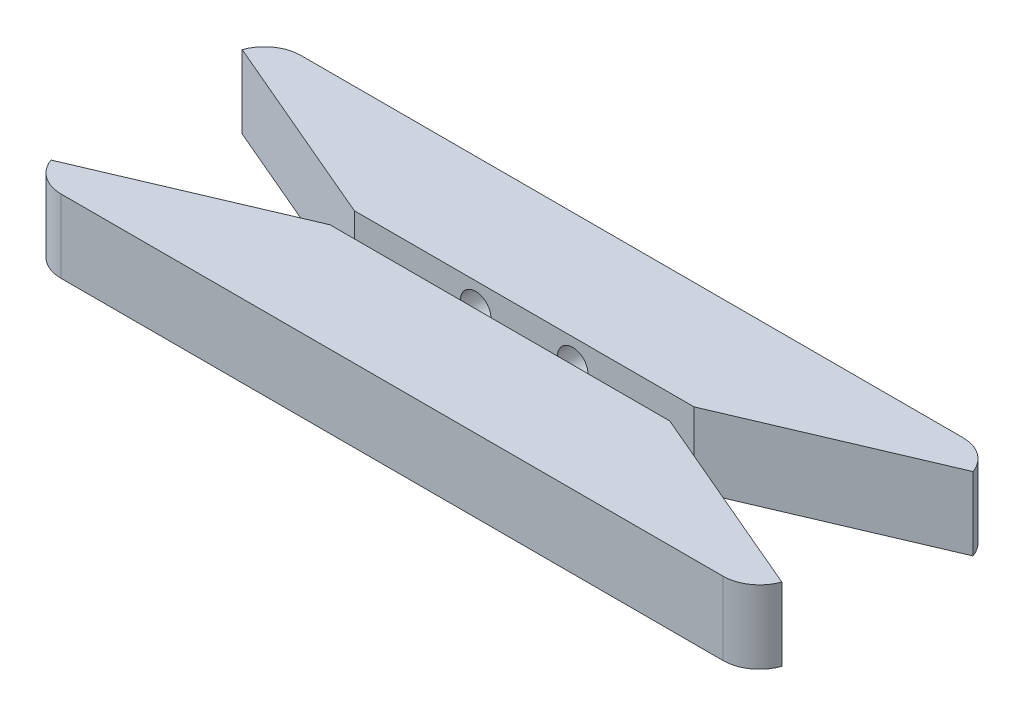
ISO-10303-21;
HEADER;
FILE_DESCRIPTION(('STEP AP214'),'2;1');
FILE_NAME('part.step','',(''),(''),'','','');
FILE_SCHEMA(('AUTOMOTIVE_DESIGN { 1 0 10303 214 1 1 1 1 }'));
ENDSEC;
DATA;
#1=APPLICATION_CONTEXT('core data for automotive mechanical design processes');
#2=APPLICATION_PROTOCOL_DEFINITION('international standard','automotive_design',2000,#1);
#3=PRODUCT_CONTEXT('',#1,'mechanical');
#4=PRODUCT('Part','Part','',(#3));
#5=PRODUCT_RELATED_PRODUCT_CATEGORY('part','',(#4));
#6=PRODUCT_DEFINITION_FORMATION('','',#4);
#7=PRODUCT_DEFINITION_CONTEXT('part definition',#1,'design');
#8=PRODUCT_DEFINITION('design','',#6,#7);
#9=PRODUCT_DEFINITION_SHAPE('','',#8);
#10=(LENGTH_UNIT() NAMED_UNIT(*) SI_UNIT(.MILLI.,.METRE.));
#11=(NAMED_UNIT(*) PLANE_ANGLE_UNIT() SI_UNIT($,.RADIAN.));
#12=(NAMED_UNIT(*) SI_UNIT($,.STERADIAN.) SOLID_ANGLE_UNIT());
#13=UNCERTAINTY_MEASURE_WITH_UNIT(LENGTH_MEASURE(1.E-05),#10,'distance_accuracy_value','');
#14=(GEOMETRIC_REPRESENTATION_CONTEXT(3) GLOBAL_UNCERTAINTY_ASSIGNED_CONTEXT((#13)) GLOBAL_UNIT_ASSIGNED_CONTEXT((#10,
#11,#12)) REPRESENTATION_CONTEXT('',''));
#15=CARTESIAN_POINT('',(0.,0.,0.));
#16=DIRECTION('',(0.,0.,1.));
#17=DIRECTION('',(1.,0.,0.));
#18=AXIS2_PLACEMENT_3D('',#15,#16,#17);
#19=CARTESIAN_POINT('',(-60.,12.,17.7));
#20=DIRECTION('',(0.392483925789515,0.,0.919758864049078));
#21=DIRECTION('',(-0.919758864049078,0.,0.392483925789515));
#22=AXIS2_PLACEMENT_3D('',#19,#20,#21);
#23=PLANE('',#22);
#24=DIRECTION('',(0.919758864049078,0.,-0.392483925789515));
#25=VECTOR('',#24,1.);
#26=CARTESIAN_POINT('',(-60.,0.,17.7));
#27=LINE('',#26,#25);
#28=CARTESIAN_POINT('',(-60.,0.,17.7));
#29=VERTEX_POINT('',#28);
#30=CARTESIAN_POINT('',(-27.895,0.,4.));
#31=VERTEX_POINT('',#30);
#32=EDGE_CURVE('E112',#29,#31,#27,.T.);
#33=ORIENTED_EDGE('',*,*,#32,.F.);
#34=DIRECTION('',(0.,-1.,0.));
#35=VECTOR('',#34,1.);
#36=CARTESIAN_POINT('',(-60.,12.,17.7));
#37=LINE('',#36,#35);
#38=CARTESIAN_POINT('',(-60.,12.,17.7));
#39=VERTEX_POINT('',#38);
#40=EDGE_CURVE('E95',#39,#29,#37,.T.);
#41=ORIENTED_EDGE('',*,*,#40,.F.);
#42=DIRECTION('',(0.919758864049078,0.,-0.392483925789515));
#43=VECTOR('',#42,1.);
#44=CARTESIAN_POINT('',(-60.,12.,17.7));
#45=LINE('',#44,#43);
#46=CARTESIAN_POINT('',(-27.895,12.,4.));
#47=VERTEX_POINT('',#46);
#48=EDGE_CURVE('E102',#39,#47,#45,.T.);
#49=ORIENTED_EDGE('',*,*,#48,.T.);
#50=DIRECTION('',(0.,-1.,0.));
#51=VECTOR('',#50,1.);
#52=CARTESIAN_POINT('',(-27.895,12.,4.));
#53=LINE('',#52,#51);
#54=EDGE_CURVE('E113',#47,#31,#53,.T.);
#55=ORIENTED_EDGE('',*,*,#54,.T.);
#56=EDGE_LOOP('',(#33,#41,#49,#55));
#57=FACE_BOUND('',#56,.T.);
#58=ADVANCED_FACE('F43',(#57),#23,.F.);
#59=CARTESIAN_POINT('',(-27.895,12.,4.));
#60=DIRECTION('',(0.,0.,1.));
#61=DIRECTION('',(-1.,0.,0.));
#62=AXIS2_PLACEMENT_3D('',#59,#60,#61);
#63=PLANE('',#62);
#64=CARTESIAN_POINT('',(-7.97,8.,4.));
#65=DIRECTION('',(0.,0.,1.));
#66=DIRECTION('',(1.,0.,0.));
#67=AXIS2_PLACEMENT_3D('',#64,#65,#66);
#68=CIRCLE('',#67,2.5);
#69=CARTESIAN_POINT('',(-5.47,8.,4.));
#70=VERTEX_POINT('',#69);
#71=EDGE_CURVE('E155',#70,#70,#68,.T.);
#72=ORIENTED_EDGE('',*,*,#71,.T.);
#73=EDGE_LOOP('',(#72));
#74=FACE_BOUND('',#73,.T.);
#75=CARTESIAN_POINT('',(7.97,8.,4.));
#76=DIRECTION('',(0.,0.,1.));
#77=DIRECTION('',(-1.,0.,0.));
#78=AXIS2_PLACEMENT_3D('',#75,#76,#77);
#79=CIRCLE('',#78,2.5);
#80=CARTESIAN_POINT('',(5.47,8.,4.));
#81=VERTEX_POINT('',#80);
#82=EDGE_CURVE('E164',#81,#81,#79,.T.);
#83=ORIENTED_EDGE('',*,*,#82,.T.);
#84=EDGE_LOOP('',(#83));
#85=FACE_BOUND('',#84,.T.);
#86=DIRECTION('',(1.,0.,0.));
#87=VECTOR('',#86,1.);
#88=CARTESIAN_POINT('',(-27.895,0.,4.));
#89=LINE('',#88,#87);
#90=CARTESIAN_POINT('',(27.895,0.,4.));
#91=VERTEX_POINT('',#90);
#92=EDGE_CURVE('E142',#31,#91,#89,.T.);
#93=ORIENTED_EDGE('',*,*,#92,.F.);
#94=ORIENTED_EDGE('',*,*,#54,.F.);
#95=DIRECTION('',(1.,0.,0.));
#96=VECTOR('',#95,1.);
#97=CARTESIAN_POINT('',(-27.895,12.,4.));
#98=LINE('',#97,#96);
#99=CARTESIAN_POINT('',(27.895,12.,4.));
#100=VERTEX_POINT('',#99);
#101=EDGE_CURVE('E105',#47,#100,#98,.T.);
#102=ORIENTED_EDGE('',*,*,#101,.T.);
#103=DIRECTION('',(0.,-1.,0.));
#104=VECTOR('',#103,1.);
#105=CARTESIAN_POINT('',(27.895,12.,4.));
#106=LINE('',#105,#104);
#107=EDGE_CURVE('E117',#100,#91,#106,.T.);
#108=ORIENTED_EDGE('',*,*,#107,.T.);
#109=EDGE_LOOP('',(#93,#94,#102,#108));
#110=FACE_BOUND('',#109,.T.);
#111=ADVANCED_FACE('F148',(#74,#85,#110),#63,.F.);
#112=CARTESIAN_POINT('',(27.895,12.,4.));
#113=DIRECTION('',(-0.392483925789515,0.,0.919758864049078));
#114=DIRECTION('',(-0.919758864049078,0.,-0.392483925789515));
#115=AXIS2_PLACEMENT_3D('',#112,#113,#114);
#116=PLANE('',#115);
#117=DIRECTION('',(0.919758864049078,0.,0.392483925789515));
#118=VECTOR('',#117,1.);
#119=CARTESIAN_POINT('',(27.895,0.,4.));
#120=LINE('',#119,#118);
#121=CARTESIAN_POINT('',(60.,0.,17.7));
#122=VERTEX_POINT('',#121);
#123=EDGE_CURVE('E135',#91,#122,#120,.T.);
#124=ORIENTED_EDGE('',*,*,#123,.F.);
#125=ORIENTED_EDGE('',*,*,#107,.F.);
#126=DIRECTION('',(0.919758864049078,0.,0.392483925789515));
#127=VECTOR('',#126,1.);
#128=CARTESIAN_POINT('',(27.895,12.,4.));
#129=LINE('',#128,#127);
#130=CARTESIAN_POINT('',(60.,12.,17.7));
#131=VERTEX_POINT('',#130);
#132=EDGE_CURVE('E137',#100,#131,#129,.T.);
#133=ORIENTED_EDGE('',*,*,#132,.T.);
#134=DIRECTION('',(0.,-1.,0.));
#135=VECTOR('',#134,1.);
#136=CARTESIAN_POINT('',(60.,12.,17.7));
#137=LINE('',#136,#135);
#138=EDGE_CURVE('E126',#131,#122,#137,.T.);
#139=ORIENTED_EDGE('',*,*,#138,.T.);
#140=EDGE_LOOP('',(#124,#125,#133,#139));
#141=FACE_BOUND('',#140,.T.);
#142=ADVANCED_FACE('F133',(#141),#116,.F.);
#143=CARTESIAN_POINT('',(-60.,12.,21.7));
#144=DIRECTION('',(0.,0.,-1.));
#145=DIRECTION('',(1.,0.,0.));
#146=AXIS2_PLACEMENT_3D('',#143,#144,#145);
#147=PLANE('',#146);
#148=DIRECTION('',(-1.,0.,0.));
#149=VECTOR('',#148,1.);
#150=CARTESIAN_POINT('',(-60.,12.,21.7));
#151=LINE('',#150,#149);
#152=CARTESIAN_POINT('',(54.3431457505076,12.,21.7));
#153=VERTEX_POINT('',#152);
#154=CARTESIAN_POINT('',(-54.3431457505076,12.,21.7));
#155=VERTEX_POINT('',#154);
#156=EDGE_CURVE('E138',#153,#155,#151,.T.);
#157=ORIENTED_EDGE('',*,*,#156,.T.);
#158=DIRECTION('',(0.,1.,0.));
#159=VECTOR('',#158,1.);
#160=CARTESIAN_POINT('',(-54.3431457505076,12.,21.7));
#161=LINE('',#160,#159);
#162=CARTESIAN_POINT('',(-54.3431457505076,0.,21.7));
#163=VERTEX_POINT('',#162);
#164=EDGE_CURVE('E98',#163,#155,#161,.T.);
#165=ORIENTED_EDGE('',*,*,#164,.F.);
#166=DIRECTION('',(-1.,0.,0.));
#167=VECTOR('',#166,1.);
#168=CARTESIAN_POINT('',(-60.,0.,21.7));
#169=LINE('',#168,#167);
#170=CARTESIAN_POINT('',(54.3431457505076,0.,21.7));
#171=VERTEX_POINT('',#170);
#172=EDGE_CURVE('E109',#171,#163,#169,.T.);
#173=ORIENTED_EDGE('',*,*,#172,.F.);
#174=DIRECTION('',(0.,-1.,0.));
#175=VECTOR('',#174,1.);
#176=CARTESIAN_POINT('',(54.3431457505076,12.,21.7));
#177=LINE('',#176,#175);
#178=EDGE_CURVE('E115',#153,#171,#177,.T.);
#179=ORIENTED_EDGE('',*,*,#178,.F.);
#180=EDGE_LOOP('',(#157,#165,#173,#179));
#181=FACE_BOUND('',#180,.T.);
#182=ADVANCED_FACE('F230',(#181),#147,.F.);
#183=CARTESIAN_POINT('',(0.,12.,4.));
#184=DIRECTION('',(0.,1.,0.));
#185=DIRECTION('',(0.,0.,-1.));
#186=AXIS2_PLACEMENT_3D('',#183,#184,#185);
#187=PLANE('',#186);
#188=ORIENTED_EDGE('',*,*,#132,.F.);
#189=ORIENTED_EDGE('',*,*,#101,.F.);
#190=ORIENTED_EDGE('',*,*,#48,.F.);
#191=CARTESIAN_POINT('',(-54.3431457505076,12.,15.7));
#192=DIRECTION('',(0.,-1.,0.));
#193=DIRECTION('',(0.,0.,-1.));
#194=AXIS2_PLACEMENT_3D('',#191,#192,#193);
#195=CIRCLE('',#194,6.);
#196=EDGE_CURVE('E51',#155,#39,#195,.T.);
#197=ORIENTED_EDGE('',*,*,#196,.F.);
#198=ORIENTED_EDGE('',*,*,#156,.F.);
#199=CARTESIAN_POINT('',(54.3431457505076,12.,15.7));
#200=DIRECTION('',(0.,-1.,0.));
#201=DIRECTION('',(0.,0.,-1.));
#202=AXIS2_PLACEMENT_3D('',#199,#200,#201);
#203=CIRCLE('',#202,6.);
#204=EDGE_CURVE('E12',#131,#153,#203,.T.);
#205=ORIENTED_EDGE('',*,*,#204,.F.);
#206=EDGE_LOOP('',(#188,#189,#190,#197,#198,#205));
#207=FACE_BOUND('',#206,.T.);
#208=ADVANCED_FACE('F103',(#207),#187,.T.);
#209=CARTESIAN_POINT('',(0.,0.,4.));
#210=DIRECTION('',(0.,1.,0.));
#211=DIRECTION('',(0.,0.,-1.));
#212=AXIS2_PLACEMENT_3D('',#209,#210,#211);
#213=PLANE('',#212);
#214=ORIENTED_EDGE('',*,*,#172,.T.);
#215=CARTESIAN_POINT('',(-54.3431457505076,0.,15.7));
#216=DIRECTION('',(0.,-1.,0.));
#217=DIRECTION('',(0.,0.,-1.));
#218=AXIS2_PLACEMENT_3D('',#215,#216,#217);
#219=CIRCLE('',#218,6.);
#220=EDGE_CURVE('E122',#29,#163,#219,.F.);
#221=ORIENTED_EDGE('',*,*,#220,.F.);
#222=ORIENTED_EDGE('',*,*,#32,.T.);
#223=ORIENTED_EDGE('',*,*,#92,.T.);
#224=ORIENTED_EDGE('',*,*,#123,.T.);
#225=CARTESIAN_POINT('',(54.3431457505076,0.,15.7));
#226=DIRECTION('',(0.,-1.,0.));
#227=DIRECTION('',(0.,0.,-1.));
#228=AXIS2_PLACEMENT_3D('',#225,#226,#227);
#229=CIRCLE('',#228,6.);
#230=EDGE_CURVE('E100',#171,#122,#229,.F.);
#231=ORIENTED_EDGE('',*,*,#230,.F.);
#232=EDGE_LOOP('',(#214,#221,#222,#223,#224,#231));
#233=FACE_BOUND('',#232,.T.);
#234=ADVANCED_FACE('F141',(#233),#213,.F.);
#235=CARTESIAN_POINT('',(7.97,8.,12.5));
#236=DIRECTION('',(0.,0.,-1.));
#237=DIRECTION('',(1.,0.,0.));
#238=AXIS2_PLACEMENT_3D('',#235,#236,#237);
#239=CYLINDRICAL_SURFACE('',#238,2.5);
#240=CARTESIAN_POINT('',(7.97,8.,12.5));
#241=DIRECTION('',(0.,0.,1.));
#242=DIRECTION('',(-1.,0.,0.));
#243=AXIS2_PLACEMENT_3D('',#240,#241,#242);
#244=CIRCLE('',#243,2.5);
#245=CARTESIAN_POINT('',(5.47,8.,12.5));
#246=VERTEX_POINT('',#245);
#247=EDGE_CURVE('E160',#246,#246,#244,.T.);
#248=ORIENTED_EDGE('',*,*,#247,.T.);
#249=EDGE_LOOP('',(#248));
#250=FACE_BOUND('',#249,.T.);
#251=ORIENTED_EDGE('',*,*,#82,.F.);
#252=EDGE_LOOP('',(#251));
#253=FACE_BOUND('',#252,.T.);
#254=ADVANCED_FACE('F169',(#250,#253),#239,.F.);
#255=CARTESIAN_POINT('',(7.97,8.,12.5));
#256=DIRECTION('',(0.,0.,1.));
#257=DIRECTION('',(-1.,0.,0.));
#258=AXIS2_PLACEMENT_3D('',#255,#256,#257);
#259=PLANE('',#258);
#260=ORIENTED_EDGE('',*,*,#247,.F.);
#261=EDGE_LOOP('',(#260));
#262=FACE_BOUND('',#261,.T.);
#263=ADVANCED_FACE('F171',(#262),#259,.F.);
#264=CARTESIAN_POINT('',(-7.97,8.,12.5));
#265=DIRECTION('',(0.,0.,-1.));
#266=DIRECTION('',(1.,0.,0.));
#267=AXIS2_PLACEMENT_3D('',#264,#265,#266);
#268=CYLINDRICAL_SURFACE('',#267,2.5);
#269=CARTESIAN_POINT('',(-7.97,8.,12.5));
#270=DIRECTION('',(0.,0.,1.));
#271=DIRECTION('',(1.,0.,0.));
#272=AXIS2_PLACEMENT_3D('',#269,#270,#271);
#273=CIRCLE('',#272,2.5);
#274=CARTESIAN_POINT('',(-5.47,8.,12.5));
#275=VERTEX_POINT('',#274);
#276=EDGE_CURVE('E153',#275,#275,#273,.T.);
#277=ORIENTED_EDGE('',*,*,#276,.T.);
#278=EDGE_LOOP('',(#277));
#279=FACE_BOUND('',#278,.T.);
#280=ORIENTED_EDGE('',*,*,#71,.F.);
#281=EDGE_LOOP('',(#280));
#282=FACE_BOUND('',#281,.T.);
#283=ADVANCED_FACE('F178',(#279,#282),#268,.F.);
#284=CARTESIAN_POINT('',(-7.97,8.,12.5));
#285=DIRECTION('',(0.,0.,-1.));
#286=DIRECTION('',(1.,0.,0.));
#287=AXIS2_PLACEMENT_3D('',#284,#285,#286);
#288=PLANE('',#287);
#289=ORIENTED_EDGE('',*,*,#276,.F.);
#290=EDGE_LOOP('',(#289));
#291=FACE_BOUND('',#290,.T.);
#292=ADVANCED_FACE('F192',(#291),#288,.T.);
#293=CARTESIAN_POINT('',(54.3431457505076,12.,15.7));
#294=DIRECTION('',(0.,-1.,0.));
#295=DIRECTION('',(0.,0.,1.));
#296=AXIS2_PLACEMENT_3D('',#293,#294,#295);
#297=CYLINDRICAL_SURFACE('',#296,6.);
#298=ORIENTED_EDGE('',*,*,#204,.T.);
#299=ORIENTED_EDGE('',*,*,#178,.T.);
#300=ORIENTED_EDGE('',*,*,#230,.T.);
#301=ORIENTED_EDGE('',*,*,#138,.F.);
#302=EDGE_LOOP('',(#298,#299,#300,#301));
#303=FACE_BOUND('',#302,.T.);
#304=ADVANCED_FACE('F125',(#303),#297,.T.);
#305=CARTESIAN_POINT('',(-54.3431457505076,12.,15.7));
#306=DIRECTION('',(0.,1.,0.));
#307=DIRECTION('',(0.,0.,-1.));
#308=AXIS2_PLACEMENT_3D('',#305,#306,#307);
#309=CYLINDRICAL_SURFACE('',#308,6.);
#310=ORIENTED_EDGE('',*,*,#196,.T.);
#311=ORIENTED_EDGE('',*,*,#40,.T.);
#312=ORIENTED_EDGE('',*,*,#220,.T.);
#313=ORIENTED_EDGE('',*,*,#164,.T.);
#314=EDGE_LOOP('',(#310,#311,#312,#313));
#315=FACE_BOUND('',#314,.T.);
#316=ADVANCED_FACE('F45',(#315),#309,.T.);
#317=CLOSED_SHELL('',(#58,#111,#142,#182,#208,#234,#254,#263,#283,#292,#304,#316));
#318=MANIFOLD_SOLID_BREP('B2',#317);
#319=CARTESIAN_POINT('',(-60.,12.,-13.7));
#320=DIRECTION('',(0.392483925789515,0.,-0.919758864049078));
#321=DIRECTION('',(-0.919758864049078,0.,-0.392483925789515));
#322=AXIS2_PLACEMENT_3D('',#319,#320,#321);
#323=PLANE('',#322);
#324=DIRECTION('',(0.919758864049078,0.,0.392483925789515));
#325=VECTOR('',#324,1.);
#326=CARTESIAN_POINT('',(-60.,0.,-13.7));
#327=LINE('',#326,#325);
#328=CARTESIAN_POINT('',(-60.,0.,-13.7));
#329=VERTEX_POINT('',#328);
#330=CARTESIAN_POINT('',(-27.895,0.,0.));
#331=VERTEX_POINT('',#330);
#332=EDGE_CURVE('E384',#329,#331,#327,.T.);
#333=ORIENTED_EDGE('',*,*,#332,.T.);
#334=DIRECTION('',(0.,-1.,0.));
#335=VECTOR('',#334,1.);
#336=CARTESIAN_POINT('',(-27.895,12.,0.));
#337=LINE('',#336,#335);
#338=CARTESIAN_POINT('',(-27.895,12.,0.));
#339=VERTEX_POINT('',#338);
#340=EDGE_CURVE('E341',#339,#331,#337,.T.);
#341=ORIENTED_EDGE('',*,*,#340,.F.);
#342=DIRECTION('',(0.919758864049078,0.,0.392483925789515));
#343=VECTOR('',#342,1.);
#344=CARTESIAN_POINT('',(-60.,12.,-13.7));
#345=LINE('',#344,#343);
#346=CARTESIAN_POINT('',(-60.,12.,-13.7));
#347=VERTEX_POINT('',#346);
#348=EDGE_CURVE('E331',#347,#339,#345,.T.);
#349=ORIENTED_EDGE('',*,*,#348,.F.);
#350=DIRECTION('',(0.,-1.,0.));
#351=VECTOR('',#350,1.);
#352=CARTESIAN_POINT('',(-60.,12.,-13.7));
#353=LINE('',#352,#351);
#354=EDGE_CURVE('E339',#347,#329,#353,.T.);
#355=ORIENTED_EDGE('',*,*,#354,.T.);
#356=EDGE_LOOP('',(#333,#341,#349,#355));
#357=FACE_BOUND('',#356,.T.);
#358=ADVANCED_FACE('F279',(#357),#323,.F.);
#359=CARTESIAN_POINT('',(-27.895,12.,0.));
#360=DIRECTION('',(0.,0.,-1.));
#361=DIRECTION('',(-1.,0.,0.));
#362=AXIS2_PLACEMENT_3D('',#359,#360,#361);
#363=PLANE('',#362);
#364=CARTESIAN_POINT('',(-7.97,8.,0.));
#365=DIRECTION('',(0.,0.,1.));
#366=DIRECTION('',(1.,0.,0.));
#367=AXIS2_PLACEMENT_3D('',#364,#365,#366);
#368=CIRCLE('',#367,2.5);
#369=CARTESIAN_POINT('',(-5.47,8.,0.));
#370=VERTEX_POINT('',#369);
#371=EDGE_CURVE('E395',#370,#370,#368,.T.);
#372=ORIENTED_EDGE('',*,*,#371,.F.);
#373=EDGE_LOOP('',(#372));
#374=FACE_BOUND('',#373,.T.);
#375=CARTESIAN_POINT('',(7.97,8.,0.));
#376=DIRECTION('',(0.,0.,1.));
#377=DIRECTION('',(-1.,0.,0.));
#378=AXIS2_PLACEMENT_3D('',#375,#376,#377);
#379=CIRCLE('',#378,2.5);
#380=CARTESIAN_POINT('',(5.47,8.,0.));
#381=VERTEX_POINT('',#380);
#382=EDGE_CURVE('E389',#381,#381,#379,.T.);
#383=ORIENTED_EDGE('',*,*,#382,.F.);
#384=EDGE_LOOP('',(#383));
#385=FACE_BOUND('',#384,.T.);
#386=DIRECTION('',(1.,0.,0.));
#387=VECTOR('',#386,1.);
#388=CARTESIAN_POINT('',(-27.895,0.,0.));
#389=LINE('',#388,#387);
#390=CARTESIAN_POINT('',(27.895,0.,0.));
#391=VERTEX_POINT('',#390);
#392=EDGE_CURVE('E375',#331,#391,#389,.T.);
#393=ORIENTED_EDGE('',*,*,#392,.T.);
#394=DIRECTION('',(0.,-1.,0.));
#395=VECTOR('',#394,1.);
#396=CARTESIAN_POINT('',(27.895,12.,0.));
#397=LINE('',#396,#395);
#398=CARTESIAN_POINT('',(27.895,12.,0.));
#399=VERTEX_POINT('',#398);
#400=EDGE_CURVE('E351',#399,#391,#397,.T.);
#401=ORIENTED_EDGE('',*,*,#400,.F.);
#402=DIRECTION('',(1.,0.,0.));
#403=VECTOR('',#402,1.);
#404=CARTESIAN_POINT('',(-27.895,12.,0.));
#405=LINE('',#404,#403);
#406=EDGE_CURVE('E343',#339,#399,#405,.T.);
#407=ORIENTED_EDGE('',*,*,#406,.F.);
#408=ORIENTED_EDGE('',*,*,#340,.T.);
#409=EDGE_LOOP('',(#393,#401,#407,#408));
#410=FACE_BOUND('',#409,.T.);
#411=ADVANCED_FACE('F410',(#374,#385,#410),#363,.F.);
#412=CARTESIAN_POINT('',(27.895,12.,0.));
#413=DIRECTION('',(-0.392483925789515,0.,-0.919758864049078));
#414=DIRECTION('',(-0.919758864049078,0.,0.392483925789515));
#415=AXIS2_PLACEMENT_3D('',#412,#413,#414);
#416=PLANE('',#415);
#417=DIRECTION('',(0.919758864049078,0.,-0.392483925789515));
#418=VECTOR('',#417,1.);
#419=CARTESIAN_POINT('',(27.895,0.,0.));
#420=LINE('',#419,#418);
#421=CARTESIAN_POINT('',(60.,0.,-13.7));
#422=VERTEX_POINT('',#421);
#423=EDGE_CURVE('E364',#391,#422,#420,.T.);
#424=ORIENTED_EDGE('',*,*,#423,.T.);
#425=DIRECTION('',(0.,-1.,0.));
#426=VECTOR('',#425,1.);
#427=CARTESIAN_POINT('',(60.,12.,-13.7));
#428=LINE('',#427,#426);
#429=CARTESIAN_POINT('',(60.,12.,-13.7));
#430=VERTEX_POINT('',#429);
#431=EDGE_CURVE('E373',#430,#422,#428,.T.);
#432=ORIENTED_EDGE('',*,*,#431,.F.);
#433=DIRECTION('',(0.919758864049078,0.,-0.392483925789515));
#434=VECTOR('',#433,1.);
#435=CARTESIAN_POINT('',(27.895,12.,0.));
#436=LINE('',#435,#434);
#437=EDGE_CURVE('E379',#399,#430,#436,.T.);
#438=ORIENTED_EDGE('',*,*,#437,.F.);
#439=ORIENTED_EDGE('',*,*,#400,.T.);
#440=EDGE_LOOP('',(#424,#432,#438,#439));
#441=FACE_BOUND('',#440,.T.);
#442=ADVANCED_FACE('F371',(#441),#416,.F.);
#443=CARTESIAN_POINT('',(-60.,12.,-17.7));
#444=DIRECTION('',(0.,0.,1.));
#445=DIRECTION('',(1.,0.,0.));
#446=AXIS2_PLACEMENT_3D('',#443,#444,#445);
#447=PLANE('',#446);
#448=DIRECTION('',(-1.,0.,0.));
#449=VECTOR('',#448,1.);
#450=CARTESIAN_POINT('',(-60.,12.,-17.7));
#451=LINE('',#450,#449);
#452=CARTESIAN_POINT('',(54.3431457505076,12.,-17.7));
#453=VERTEX_POINT('',#452);
#454=CARTESIAN_POINT('',(-54.3431457505076,12.,-17.7));
#455=VERTEX_POINT('',#454);
#456=EDGE_CURVE('E333',#453,#455,#451,.T.);
#457=ORIENTED_EDGE('',*,*,#456,.F.);
#458=DIRECTION('',(0.,-1.,0.));
#459=VECTOR('',#458,1.);
#460=CARTESIAN_POINT('',(54.3431457505076,12.,-17.7));
#461=LINE('',#460,#459);
#462=CARTESIAN_POINT('',(54.3431457505076,0.,-17.7));
#463=VERTEX_POINT('',#462);
#464=EDGE_CURVE('E349',#453,#463,#461,.T.);
#465=ORIENTED_EDGE('',*,*,#464,.T.);
#466=DIRECTION('',(-1.,0.,0.));
#467=VECTOR('',#466,1.);
#468=CARTESIAN_POINT('',(-60.,0.,-17.7));
#469=LINE('',#468,#467);
#470=CARTESIAN_POINT('',(-54.3431457505076,0.,-17.7));
#471=VERTEX_POINT('',#470);
#472=EDGE_CURVE('E344',#463,#471,#469,.T.);
#473=ORIENTED_EDGE('',*,*,#472,.T.);
#474=DIRECTION('',(0.,1.,0.));
#475=VECTOR('',#474,1.);
#476=CARTESIAN_POINT('',(-54.3431457505076,12.,-17.7));
#477=LINE('',#476,#475);
#478=EDGE_CURVE('E294',#471,#455,#477,.T.);
#479=ORIENTED_EDGE('',*,*,#478,.T.);
#480=EDGE_LOOP('',(#457,#465,#473,#479));
#481=FACE_BOUND('',#480,.T.);
#482=ADVANCED_FACE('F416',(#481),#447,.F.);
#483=CARTESIAN_POINT('',(0.,12.,0.));
#484=DIRECTION('',(0.,1.,0.));
#485=DIRECTION('',(0.,0.,1.));
#486=AXIS2_PLACEMENT_3D('',#483,#484,#485);
#487=PLANE('',#486);
#488=ORIENTED_EDGE('',*,*,#437,.T.);
#489=CARTESIAN_POINT('',(54.3431457505076,12.,-11.7));
#490=DIRECTION('',(0.,1.,0.));
#491=DIRECTION('',(0.,0.,1.));
#492=AXIS2_PLACEMENT_3D('',#489,#490,#491);
#493=CIRCLE('',#492,6.);
#494=EDGE_CURVE('E41',#430,#453,#493,.T.);
#495=ORIENTED_EDGE('',*,*,#494,.T.);
#496=ORIENTED_EDGE('',*,*,#456,.T.);
#497=CARTESIAN_POINT('',(-54.3431457505076,12.,-11.7));
#498=DIRECTION('',(0.,1.,0.));
#499=DIRECTION('',(0.,0.,1.));
#500=AXIS2_PLACEMENT_3D('',#497,#498,#499);
#501=CIRCLE('',#500,6.);
#502=EDGE_CURVE('E287',#455,#347,#501,.T.);
#503=ORIENTED_EDGE('',*,*,#502,.T.);
#504=ORIENTED_EDGE('',*,*,#348,.T.);
#505=ORIENTED_EDGE('',*,*,#406,.T.);
#506=EDGE_LOOP('',(#488,#495,#496,#503,#504,#505));
#507=FACE_BOUND('',#506,.T.);
#508=ADVANCED_FACE('F330',(#507),#487,.T.);
#509=CARTESIAN_POINT('',(0.,0.,0.));
#510=DIRECTION('',(0.,1.,0.));
#511=DIRECTION('',(0.,0.,1.));
#512=AXIS2_PLACEMENT_3D('',#509,#510,#511);
#513=PLANE('',#512);
#514=ORIENTED_EDGE('',*,*,#472,.F.);
#515=CARTESIAN_POINT('',(54.3431457505076,0.,-11.7));
#516=DIRECTION('',(0.,1.,0.));
#517=DIRECTION('',(0.,0.,1.));
#518=AXIS2_PLACEMENT_3D('',#515,#516,#517);
#519=CIRCLE('',#518,6.);
#520=EDGE_CURVE('E336',#463,#422,#519,.F.);
#521=ORIENTED_EDGE('',*,*,#520,.T.);
#522=ORIENTED_EDGE('',*,*,#423,.F.);
#523=ORIENTED_EDGE('',*,*,#392,.F.);
#524=ORIENTED_EDGE('',*,*,#332,.F.);
#525=CARTESIAN_POINT('',(-54.3431457505076,0.,-11.7));
#526=DIRECTION('',(0.,1.,0.));
#527=DIRECTION('',(0.,0.,1.));
#528=AXIS2_PLACEMENT_3D('',#525,#526,#527);
#529=CIRCLE('',#528,6.);
#530=EDGE_CURVE('E346',#329,#471,#529,.F.);
#531=ORIENTED_EDGE('',*,*,#530,.T.);
#532=EDGE_LOOP('',(#514,#521,#522,#523,#524,#531));
#533=FACE_BOUND('',#532,.T.);
#534=ADVANCED_FACE('F362',(#533),#513,.F.);
#535=CARTESIAN_POINT('',(7.97,8.,-8.5));
#536=DIRECTION('',(0.,0.,1.));
#537=DIRECTION('',(1.,0.,0.));
#538=AXIS2_PLACEMENT_3D('',#535,#536,#537);
#539=CYLINDRICAL_SURFACE('',#538,2.5);
#540=CARTESIAN_POINT('',(7.97,8.,-8.5));
#541=DIRECTION('',(0.,0.,1.));
#542=DIRECTION('',(-1.,0.,0.));
#543=AXIS2_PLACEMENT_3D('',#540,#541,#542);
#544=CIRCLE('',#543,2.5);
#545=CARTESIAN_POINT('',(5.47,8.,-8.5));
#546=VERTEX_POINT('',#545);
#547=EDGE_CURVE('E392',#546,#546,#544,.T.);
#548=ORIENTED_EDGE('',*,*,#547,.F.);
#549=EDGE_LOOP('',(#548));
#550=FACE_BOUND('',#549,.T.);
#551=ORIENTED_EDGE('',*,*,#382,.T.);
#552=EDGE_LOOP('',(#551));
#553=FACE_BOUND('',#552,.T.);
#554=ADVANCED_FACE('F441',(#550,#553),#539,.F.);
#555=CARTESIAN_POINT('',(7.97,8.,-8.5));
#556=DIRECTION('',(0.,0.,-1.));
#557=DIRECTION('',(-1.,0.,0.));
#558=AXIS2_PLACEMENT_3D('',#555,#556,#557);
#559=PLANE('',#558);
#560=ORIENTED_EDGE('',*,*,#547,.T.);
#561=EDGE_LOOP('',(#560));
#562=FACE_BOUND('',#561,.T.);
#563=ADVANCED_FACE('F406',(#562),#559,.F.);
#564=CARTESIAN_POINT('',(-7.97,8.,-8.5));
#565=DIRECTION('',(0.,0.,1.));
#566=DIRECTION('',(1.,0.,0.));
#567=AXIS2_PLACEMENT_3D('',#564,#565,#566);
#568=CYLINDRICAL_SURFACE('',#567,2.5);
#569=CARTESIAN_POINT('',(-7.97,8.,-8.5));
#570=DIRECTION('',(0.,0.,1.));
#571=DIRECTION('',(1.,0.,0.));
#572=AXIS2_PLACEMENT_3D('',#569,#570,#571);
#573=CIRCLE('',#572,2.5);
#574=CARTESIAN_POINT('',(-5.47,8.,-8.5));
#575=VERTEX_POINT('',#574);
#576=EDGE_CURVE('E385',#575,#575,#573,.T.);
#577=ORIENTED_EDGE('',*,*,#576,.F.);
#578=EDGE_LOOP('',(#577));
#579=FACE_BOUND('',#578,.T.);
#580=ORIENTED_EDGE('',*,*,#371,.T.);
#581=EDGE_LOOP('',(#580));
#582=FACE_BOUND('',#581,.T.);
#583=ADVANCED_FACE('F403',(#579,#582),#568,.F.);
#584=CARTESIAN_POINT('',(-7.97,8.,-8.5));
#585=DIRECTION('',(0.,0.,1.));
#586=DIRECTION('',(1.,0.,0.));
#587=AXIS2_PLACEMENT_3D('',#584,#585,#586);
#588=PLANE('',#587);
#589=ORIENTED_EDGE('',*,*,#576,.T.);
#590=EDGE_LOOP('',(#589));
#591=FACE_BOUND('',#590,.T.);
#592=ADVANCED_FACE('F401',(#591),#588,.T.);
#593=CARTESIAN_POINT('',(54.3431457505076,12.,-11.7));
#594=DIRECTION('',(0.,-1.,0.));
#595=DIRECTION('',(0.,0.,-1.));
#596=AXIS2_PLACEMENT_3D('',#593,#594,#595);
#597=CYLINDRICAL_SURFACE('',#596,6.);
#598=ORIENTED_EDGE('',*,*,#494,.F.);
#599=ORIENTED_EDGE('',*,*,#431,.T.);
#600=ORIENTED_EDGE('',*,*,#520,.F.);
#601=ORIENTED_EDGE('',*,*,#464,.F.);
#602=EDGE_LOOP('',(#598,#599,#600,#601));
#603=FACE_BOUND('',#602,.T.);
#604=ADVANCED_FACE('F377',(#603),#597,.T.);
#605=CARTESIAN_POINT('',(-54.3431457505076,12.,-11.7));
#606=DIRECTION('',(0.,1.,0.));
#607=DIRECTION('',(0.,0.,1.));
#608=AXIS2_PLACEMENT_3D('',#605,#606,#607);
#609=CYLINDRICAL_SURFACE('',#608,6.);
#610=ORIENTED_EDGE('',*,*,#502,.F.);
#611=ORIENTED_EDGE('',*,*,#478,.F.);
#612=ORIENTED_EDGE('',*,*,#530,.F.);
#613=ORIENTED_EDGE('',*,*,#354,.F.);
#614=EDGE_LOOP('',(#610,#611,#612,#613));
#615=FACE_BOUND('',#614,.T.);
#616=ADVANCED_FACE('F281',(#615),#609,.T.);
#617=CLOSED_SHELL('',(#358,#411,#442,#482,#508,#534,#554,#563,#583,#592,#604,#616));
#618=MANIFOLD_SOLID_BREP('B6',#617);
#619=ADVANCED_BREP_SHAPE_REPRESENTATION('',(#18,#318,#618),#14);
#620=SHAPE_DEFINITION_REPRESENTATION(#9,#619);
ENDSEC;
END-ISO-10303-21;
